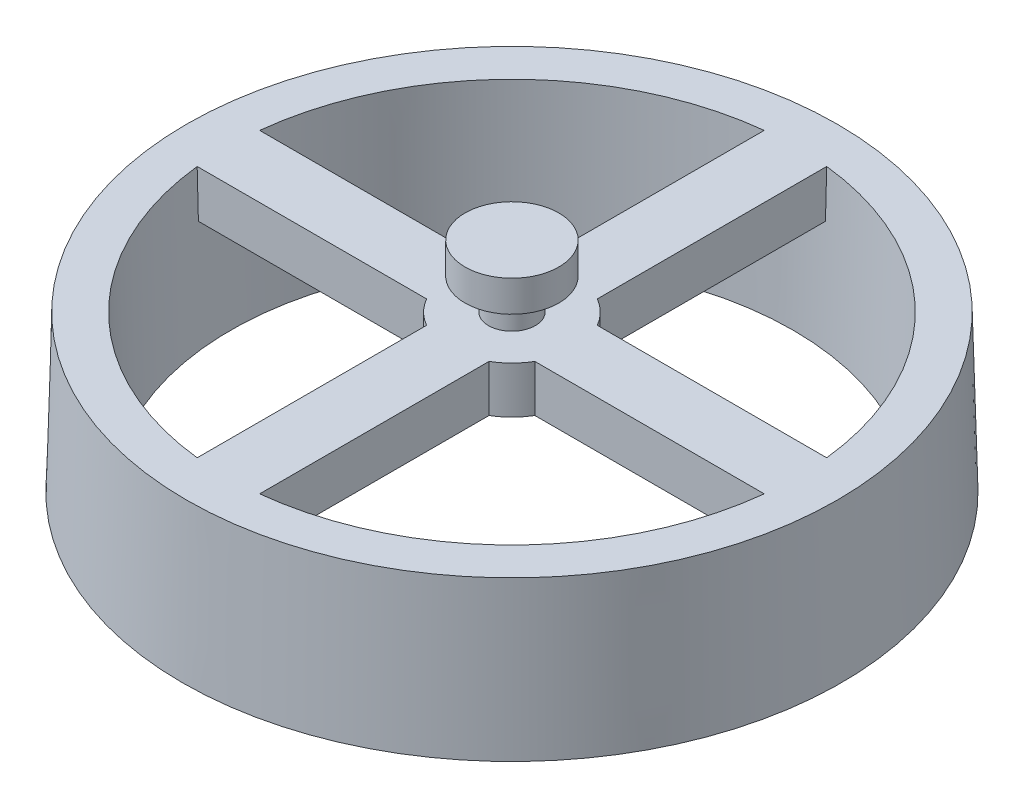
ISO-10303-21;
HEADER;
FILE_DESCRIPTION(('STEP AP214'),'2;1');
FILE_NAME('part.step','',(''),(''),'','','');
FILE_SCHEMA(('AUTOMOTIVE_DESIGN { 1 0 10303 214 1 1 1 1 }'));
ENDSEC;
DATA;
#1=APPLICATION_CONTEXT('core data for automotive mechanical design processes');
#2=APPLICATION_PROTOCOL_DEFINITION('international standard','automotive_design',2000,#1);
#3=PRODUCT_CONTEXT('',#1,'mechanical');
#4=PRODUCT('Part','Part','',(#3));
#5=PRODUCT_RELATED_PRODUCT_CATEGORY('part','',(#4));
#6=PRODUCT_DEFINITION_FORMATION('','',#4);
#7=PRODUCT_DEFINITION_CONTEXT('part definition',#1,'design');
#8=PRODUCT_DEFINITION('design','',#6,#7);
#9=PRODUCT_DEFINITION_SHAPE('','',#8);
#10=(LENGTH_UNIT() NAMED_UNIT(*) SI_UNIT(.MILLI.,.METRE.));
#11=(NAMED_UNIT(*) PLANE_ANGLE_UNIT() SI_UNIT($,.RADIAN.));
#12=(NAMED_UNIT(*) SI_UNIT($,.STERADIAN.) SOLID_ANGLE_UNIT());
#13=UNCERTAINTY_MEASURE_WITH_UNIT(LENGTH_MEASURE(1.E-05),#10,'distance_accuracy_value','');
#14=(GEOMETRIC_REPRESENTATION_CONTEXT(3) GLOBAL_UNCERTAINTY_ASSIGNED_CONTEXT((#13)) GLOBAL_UNIT_ASSIGNED_CONTEXT((#10,
#11,#12)) REPRESENTATION_CONTEXT('',''));
#15=CARTESIAN_POINT('',(0.,0.,0.));
#16=DIRECTION('',(0.,0.,1.));
#17=DIRECTION('',(1.,0.,0.));
#18=AXIS2_PLACEMENT_3D('',#15,#16,#17);
#19=CARTESIAN_POINT('',(0.,5.,0.));
#20=DIRECTION('',(0.,1.,0.));
#21=DIRECTION('',(0.,0.,1.));
#22=AXIS2_PLACEMENT_3D('',#19,#20,#21);
#23=PLANE('',#22);
#24=CARTESIAN_POINT('',(0.,5.,0.));
#25=DIRECTION('',(0.,1.,0.));
#26=DIRECTION('',(0.,0.,1.));
#27=AXIS2_PLACEMENT_3D('',#24,#25,#26);
#28=CIRCLE('',#27,10.4190703921541);
#29=CARTESIAN_POINT('',(0.,5.,10.4190703921541));
#30=VERTEX_POINT('',#29);
#31=EDGE_CURVE('E276',#30,#30,#28,.T.);
#32=ORIENTED_EDGE('',*,*,#31,.T.);
#33=EDGE_LOOP('',(#32));
#34=FACE_BOUND('',#33,.T.);
#35=CARTESIAN_POINT('',(0.,5.,0.));
#36=DIRECTION('',(0.,1.,0.));
#37=DIRECTION('',(0.,0.,1.));
#38=AXIS2_PLACEMENT_3D('',#35,#36,#37);
#39=CIRCLE('',#38,9.13092960784593);
#40=CARTESIAN_POINT('',(0.999999999999936,5.,9.07600548167737));
#41=VERTEX_POINT('',#40);
#42=CARTESIAN_POINT('',(9.07600548167736,5.,1.00000000000003));
#43=VERTEX_POINT('',#42);
#44=EDGE_CURVE('E320',#41,#43,#39,.T.);
#45=ORIENTED_EDGE('',*,*,#44,.F.);
#46=DIRECTION('',(0.,0.,-1.));
#47=VECTOR('',#46,1.);
#48=CARTESIAN_POINT('',(0.999999999999934,5.,9.50000000000001));
#49=LINE('',#48,#47);
#50=CARTESIAN_POINT('',(0.999999999999987,5.,1.73205080756888));
#51=VERTEX_POINT('',#50);
#52=EDGE_CURVE('E177',#41,#51,#49,.T.);
#53=ORIENTED_EDGE('',*,*,#52,.T.);
#54=CARTESIAN_POINT('',(0.,5.,0.));
#55=DIRECTION('',(0.,1.,0.));
#56=DIRECTION('',(0.,0.,1.));
#57=AXIS2_PLACEMENT_3D('',#54,#55,#56);
#58=CIRCLE('',#57,2.);
#59=CARTESIAN_POINT('',(1.73205080756887,5.,1.00000000000001));
#60=VERTEX_POINT('',#59);
#61=EDGE_CURVE('E548',#51,#60,#58,.T.);
#62=ORIENTED_EDGE('',*,*,#61,.T.);
#63=DIRECTION('',(1.,0.,0.));
#64=VECTOR('',#63,1.);
#65=CARTESIAN_POINT('',(9.5,5.,1.00000000000003));
#66=LINE('',#65,#64);
#67=EDGE_CURVE('E189',#60,#43,#66,.T.);
#68=ORIENTED_EDGE('',*,*,#67,.T.);
#69=EDGE_LOOP('',(#45,#53,#62,#68));
#70=FACE_BOUND('',#69,.T.);
#71=CARTESIAN_POINT('',(-9.07600548167737,5.,0.999999999999905));
#72=VERTEX_POINT('',#71);
#73=CARTESIAN_POINT('',(-1.00000000000006,5.,9.07600548167735));
#74=VERTEX_POINT('',#73);
#75=EDGE_CURVE('E282',#72,#74,#39,.T.);
#76=ORIENTED_EDGE('',*,*,#75,.F.);
#77=DIRECTION('',(1.,0.,0.));
#78=VECTOR('',#77,1.);
#79=CARTESIAN_POINT('',(-9.50000000000001,5.,0.999999999999901));
#80=LINE('',#79,#78);
#81=CARTESIAN_POINT('',(-1.73205080756889,5.,0.999999999999981));
#82=VERTEX_POINT('',#81);
#83=EDGE_CURVE('E348',#72,#82,#80,.T.);
#84=ORIENTED_EDGE('',*,*,#83,.T.);
#85=CARTESIAN_POINT('',(-1.00000000000001,5.,1.73205080756887));
#86=VERTEX_POINT('',#85);
#87=EDGE_CURVE('E258',#82,#86,#58,.T.);
#88=ORIENTED_EDGE('',*,*,#87,.T.);
#89=DIRECTION('',(0.,0.,1.));
#90=VECTOR('',#89,1.);
#91=CARTESIAN_POINT('',(-1.00000000000007,5.,9.49999999999999));
#92=LINE('',#91,#90);
#93=EDGE_CURVE('E168',#86,#74,#92,.T.);
#94=ORIENTED_EDGE('',*,*,#93,.T.);
#95=EDGE_LOOP('',(#76,#84,#88,#94));
#96=FACE_BOUND('',#95,.T.);
#97=CARTESIAN_POINT('',(9.07600548167736,5.,-0.999999999999968));
#98=VERTEX_POINT('',#97);
#99=CARTESIAN_POINT('',(1.,5.,-9.07600548167736));
#100=VERTEX_POINT('',#99);
#101=EDGE_CURVE('E272',#98,#100,#39,.T.);
#102=ORIENTED_EDGE('',*,*,#101,.F.);
#103=DIRECTION('',(-1.,0.,0.));
#104=VECTOR('',#103,1.);
#105=CARTESIAN_POINT('',(9.5,5.,-0.999999999999967));
#106=LINE('',#105,#104);
#107=CARTESIAN_POINT('',(1.73205080756888,5.,-0.999999999999993));
#108=VERTEX_POINT('',#107);
#109=EDGE_CURVE('E195',#98,#108,#106,.T.);
#110=ORIENTED_EDGE('',*,*,#109,.T.);
#111=CARTESIAN_POINT('',(1.,5.,-1.73205080756888));
#112=VERTEX_POINT('',#111);
#113=EDGE_CURVE('E259',#108,#112,#58,.T.);
#114=ORIENTED_EDGE('',*,*,#113,.T.);
#115=DIRECTION('',(0.,0.,-1.));
#116=VECTOR('',#115,1.);
#117=CARTESIAN_POINT('',(1.,5.,-9.5));
#118=LINE('',#117,#116);
#119=EDGE_CURVE('E257',#112,#100,#118,.T.);
#120=ORIENTED_EDGE('',*,*,#119,.T.);
#121=EDGE_LOOP('',(#102,#110,#114,#120));
#122=FACE_BOUND('',#121,.T.);
#123=DIRECTION('',(0.,0.,1.));
#124=VECTOR('',#123,1.);
#125=CARTESIAN_POINT('',(-1.,5.,-9.5));
#126=LINE('',#125,#124);
#127=CARTESIAN_POINT('',(-1.,5.,-9.07600548167736));
#128=VERTEX_POINT('',#127);
#129=CARTESIAN_POINT('',(-0.999999999999999,5.,-1.73205080756888));
#130=VERTEX_POINT('',#129);
#131=EDGE_CURVE('E262',#128,#130,#126,.T.);
#132=ORIENTED_EDGE('',*,*,#131,.T.);
#133=CARTESIAN_POINT('',(-1.73205080756887,5.,-1.00000000000002));
#134=VERTEX_POINT('',#133);
#135=EDGE_CURVE('E254',#130,#134,#58,.T.);
#136=ORIENTED_EDGE('',*,*,#135,.T.);
#137=DIRECTION('',(-1.,0.,0.));
#138=VECTOR('',#137,1.);
#139=CARTESIAN_POINT('',(-9.49999999999999,5.,-1.0000000000001));
#140=LINE('',#139,#138);
#141=CARTESIAN_POINT('',(-9.07600548167735,5.,-1.0000000000001));
#142=VERTEX_POINT('',#141);
#143=EDGE_CURVE('E337',#134,#142,#140,.T.);
#144=ORIENTED_EDGE('',*,*,#143,.T.);
#145=EDGE_CURVE('E277',#128,#142,#39,.T.);
#146=ORIENTED_EDGE('',*,*,#145,.F.);
#147=EDGE_LOOP('',(#132,#136,#144,#146));
#148=FACE_BOUND('',#147,.T.);
#149=CARTESIAN_POINT('',(0.,5.,0.));
#150=DIRECTION('',(0.,1.,0.));
#151=DIRECTION('',(0.,0.,1.));
#152=AXIS2_PLACEMENT_3D('',#149,#150,#151);
#153=CIRCLE('',#152,0.75);
#154=CARTESIAN_POINT('',(0.,5.,0.75));
#155=VERTEX_POINT('',#154);
#156=EDGE_CURVE('E331',#155,#155,#153,.T.);
#157=ORIENTED_EDGE('',*,*,#156,.F.);
#158=EDGE_LOOP('',(#157));
#159=FACE_BOUND('',#158,.T.);
#160=ADVANCED_FACE('F31',(#34,#70,#96,#122,#148,#159),#23,.T.);
#161=CARTESIAN_POINT('',(0.,3.5,0.));
#162=DIRECTION('',(0.,1.,0.));
#163=DIRECTION('',(0.,0.,1.));
#164=AXIS2_PLACEMENT_3D('',#161,#162,#163);
#165=CYLINDRICAL_SURFACE('',#164,2.);
#166=DIRECTION('',(0.,1.,0.));
#167=VECTOR('',#166,1.);
#168=CARTESIAN_POINT('',(1.73205080756888,3.5,-0.999999999999993));
#169=LINE('',#168,#167);
#170=CARTESIAN_POINT('',(1.73205080756888,3.5,-0.999999999999993));
#171=VERTEX_POINT('',#170);
#172=EDGE_CURVE('E202',#171,#108,#169,.T.);
#173=ORIENTED_EDGE('',*,*,#172,.F.);
#174=CARTESIAN_POINT('',(0.,3.5,0.));
#175=DIRECTION('',(0.,1.,0.));
#176=DIRECTION('',(0.,0.,1.));
#177=AXIS2_PLACEMENT_3D('',#174,#175,#176);
#178=CIRCLE('',#177,2.);
#179=CARTESIAN_POINT('',(1.,3.5,-1.73205080756888));
#180=VERTEX_POINT('',#179);
#181=EDGE_CURVE('E248',#171,#180,#178,.T.);
#182=ORIENTED_EDGE('',*,*,#181,.T.);
#183=DIRECTION('',(0.,1.,0.));
#184=VECTOR('',#183,1.);
#185=CARTESIAN_POINT('',(1.,3.5,-1.73205080756888));
#186=LINE('',#185,#184);
#187=EDGE_CURVE('E253',#180,#112,#186,.T.);
#188=ORIENTED_EDGE('',*,*,#187,.T.);
#189=ORIENTED_EDGE('',*,*,#113,.F.);
#190=EDGE_LOOP('',(#173,#182,#188,#189));
#191=FACE_BOUND('',#190,.T.);
#192=ADVANCED_FACE('F297',(#191),#165,.T.);
#193=DIRECTION('',(0.,1.,0.));
#194=VECTOR('',#193,1.);
#195=CARTESIAN_POINT('',(-1.73205080756887,3.5,-1.00000000000002));
#196=LINE('',#195,#194);
#197=CARTESIAN_POINT('',(-1.73205080756887,3.5,-1.00000000000002));
#198=VERTEX_POINT('',#197);
#199=EDGE_CURVE('E184',#198,#134,#196,.T.);
#200=ORIENTED_EDGE('',*,*,#199,.T.);
#201=ORIENTED_EDGE('',*,*,#135,.F.);
#202=DIRECTION('',(0.,1.,0.));
#203=VECTOR('',#202,1.);
#204=CARTESIAN_POINT('',(-0.999999999999999,3.5,-1.73205080756888));
#205=LINE('',#204,#203);
#206=CARTESIAN_POINT('',(-0.999999999999999,3.5,-1.73205080756888));
#207=VERTEX_POINT('',#206);
#208=EDGE_CURVE('E264',#207,#130,#205,.T.);
#209=ORIENTED_EDGE('',*,*,#208,.F.);
#210=EDGE_CURVE('E158',#207,#198,#178,.T.);
#211=ORIENTED_EDGE('',*,*,#210,.T.);
#212=EDGE_LOOP('',(#200,#201,#209,#211));
#213=FACE_BOUND('',#212,.T.);
#214=ADVANCED_FACE('F356',(#213),#165,.T.);
#215=DIRECTION('',(0.,1.,0.));
#216=VECTOR('',#215,1.);
#217=CARTESIAN_POINT('',(1.73205080756887,3.5,1.00000000000001));
#218=LINE('',#217,#216);
#219=CARTESIAN_POINT('',(1.73205080756887,3.5,1.00000000000001));
#220=VERTEX_POINT('',#219);
#221=EDGE_CURVE('E197',#220,#60,#218,.T.);
#222=ORIENTED_EDGE('',*,*,#221,.T.);
#223=ORIENTED_EDGE('',*,*,#61,.F.);
#224=DIRECTION('',(0.,1.,0.));
#225=VECTOR('',#224,1.);
#226=CARTESIAN_POINT('',(0.999999999999987,3.5,1.73205080756888));
#227=LINE('',#226,#225);
#228=CARTESIAN_POINT('',(0.999999999999987,3.5,1.73205080756888));
#229=VERTEX_POINT('',#228);
#230=EDGE_CURVE('E169',#229,#51,#227,.T.);
#231=ORIENTED_EDGE('',*,*,#230,.F.);
#232=EDGE_CURVE('E159',#229,#220,#178,.T.);
#233=ORIENTED_EDGE('',*,*,#232,.T.);
#234=EDGE_LOOP('',(#222,#223,#231,#233));
#235=FACE_BOUND('',#234,.T.);
#236=ADVANCED_FACE('F298',(#235),#165,.T.);
#237=CARTESIAN_POINT('',(0.,0.,0.));
#238=DIRECTION('',(0.,1.,0.));
#239=DIRECTION('',(0.,0.,1.));
#240=AXIS2_PLACEMENT_3D('',#237,#238,#239);
#241=PLANE('',#240);
#242=CARTESIAN_POINT('',(0.,0.,0.));
#243=DIRECTION('',(0.,1.,0.));
#244=DIRECTION('',(0.,0.,1.));
#245=AXIS2_PLACEMENT_3D('',#242,#243,#244);
#246=CIRCLE('',#245,10.55);
#247=CARTESIAN_POINT('',(0.,0.,10.55));
#248=VERTEX_POINT('',#247);
#249=EDGE_CURVE('E273',#248,#248,#246,.T.);
#250=ORIENTED_EDGE('',*,*,#249,.F.);
#251=EDGE_LOOP('',(#250));
#252=FACE_BOUND('',#251,.T.);
#253=CARTESIAN_POINT('',(0.,0.,0.));
#254=DIRECTION('',(0.,1.,0.));
#255=DIRECTION('',(0.,0.,1.));
#256=AXIS2_PLACEMENT_3D('',#253,#254,#255);
#257=CIRCLE('',#256,9.);
#258=CARTESIAN_POINT('',(0.,0.,9.));
#259=VERTEX_POINT('',#258);
#260=EDGE_CURVE('E267',#259,#259,#257,.T.);
#261=ORIENTED_EDGE('',*,*,#260,.T.);
#262=EDGE_LOOP('',(#261));
#263=FACE_BOUND('',#262,.T.);
#264=ADVANCED_FACE('F302',(#252,#263),#241,.F.);
#265=CARTESIAN_POINT('',(0.,0.,0.));
#266=DIRECTION('',(0.,-1.,0.));
#267=DIRECTION('',(0.,0.,1.));
#268=AXIS2_PLACEMENT_3D('',#265,#266,#267);
#269=CONICAL_SURFACE('',#268,10.55,0.026179938779915);
#270=ORIENTED_EDGE('',*,*,#31,.F.);
#271=EDGE_LOOP('',(#270));
#272=FACE_BOUND('',#271,.T.);
#273=ORIENTED_EDGE('',*,*,#249,.T.);
#274=EDGE_LOOP('',(#273));
#275=FACE_BOUND('',#274,.T.);
#276=ADVANCED_FACE('F304',(#272,#275),#269,.T.);
#277=CARTESIAN_POINT('',(0.,0.,0.));
#278=DIRECTION('',(0.,1.,0.));
#279=DIRECTION('',(0.,0.,1.));
#280=AXIS2_PLACEMENT_3D('',#277,#278,#279);
#281=CONICAL_SURFACE('',#280,9.,0.026179938779915);
#282=CARTESIAN_POINT('',(9.42579223211915,18.2804236839161,-0.999999999999967));
#283=CARTESIAN_POINT('',(9.30244407730847,13.5961445368287,-0.999999999999967));
#284=CARTESIAN_POINT('',(9.17906550105769,8.91186619120519,-0.999999999999968));
#285=CARTESIAN_POINT('',(8.93224750567553,-0.456688897130122,-0.999999999999969));
#286=CARTESIAN_POINT('',(8.80880808654414,-5.14096563984194,-0.999999999999969));
#287=CARTESIAN_POINT('',(8.68533824597266,-9.82524158108984,-0.99999999999997));
#288=B_SPLINE_CURVE_WITH_KNOTS('',3,(#282,#283,#284,#285,#286,#287),.UNSPECIFIED.,.F.,.F.,(4,2,
4),(0.,14.05770866931,28.1154173386685),.UNSPECIFIED.);
#289=CARTESIAN_POINT('',(9.03648786389613,3.5,-0.999999999999968));
#290=VERTEX_POINT('',#289);
#291=EDGE_CURVE('E235',#98,#290,#288,.T.);
#292=ORIENTED_EDGE('',*,*,#291,.F.);
#293=ORIENTED_EDGE('',*,*,#101,.T.);
#294=CARTESIAN_POINT('',(1.,-9.82524158108985,-8.68533824597266));
#295=CARTESIAN_POINT('',(1.,-5.14096563984194,-8.80880808654414));
#296=CARTESIAN_POINT('',(1.,-0.456688897130124,-8.93224750567552));
#297=CARTESIAN_POINT('',(1.,8.9118661912052,-9.17906550105769));
#298=CARTESIAN_POINT('',(1.,13.5961445368287,-9.30244407730846));
#299=CARTESIAN_POINT('',(1.,18.2804236839161,-9.42579223211915));
#300=B_SPLINE_CURVE_WITH_KNOTS('',3,(#294,#295,#296,#297,#298,#299),.UNSPECIFIED.,.F.,.F.,(4,2,
4),(0.,14.0577086693585,28.1154173386685),.UNSPECIFIED.);
#301=CARTESIAN_POINT('',(1.,3.5,-9.03648786389613));
#302=VERTEX_POINT('',#301);
#303=EDGE_CURVE('E44',#302,#100,#300,.T.);
#304=ORIENTED_EDGE('',*,*,#303,.F.);
#305=CARTESIAN_POINT('',(0.,3.5,0.));
#306=DIRECTION('',(0.,1.,0.));
#307=DIRECTION('',(0.,0.,1.));
#308=AXIS2_PLACEMENT_3D('',#305,#306,#307);
#309=CIRCLE('',#308,9.09165072549215);
#310=CARTESIAN_POINT('',(-1.,3.5,-9.03648786389612));
#311=VERTEX_POINT('',#310);
#312=EDGE_CURVE('E280',#302,#311,#309,.T.);
#313=ORIENTED_EDGE('',*,*,#312,.T.);
#314=CARTESIAN_POINT('',(-1.,18.2804236839161,-9.42579223211915));
#315=CARTESIAN_POINT('',(-1.,13.5961445368287,-9.30244407730846));
#316=CARTESIAN_POINT('',(-1.,8.9118661912052,-9.17906550105769));
#317=CARTESIAN_POINT('',(-1.,-0.456688897130123,-8.93224750567552));
#318=CARTESIAN_POINT('',(-1.,-5.14096563984194,-8.80880808654414));
#319=CARTESIAN_POINT('',(-1.,-9.82524158108984,-8.68533824597266));
#320=B_SPLINE_CURVE_WITH_KNOTS('',3,(#314,#315,#316,#317,#318,#319),.UNSPECIFIED.,.F.,.F.,(4,2,
4),(0.,14.05770866931,28.1154173386685),.UNSPECIFIED.);
#321=EDGE_CURVE('E11',#128,#311,#320,.T.);
#322=ORIENTED_EDGE('',*,*,#321,.F.);
#323=ORIENTED_EDGE('',*,*,#145,.T.);
#324=CARTESIAN_POINT('',(-8.68533824597265,-9.82524158108987,-1.00000000000009));
#325=CARTESIAN_POINT('',(-8.80880808654413,-5.14096563984196,-1.00000000000009));
#326=CARTESIAN_POINT('',(-8.93224750567551,-0.456688897130131,-1.00000000000009));
#327=CARTESIAN_POINT('',(-9.17906550105768,8.9118661912052,-1.0000000000001));
#328=CARTESIAN_POINT('',(-9.30244407730845,13.5961445368287,-1.0000000000001));
#329=CARTESIAN_POINT('',(-9.42579223211914,18.2804236839161,-1.0000000000001));
#330=B_SPLINE_CURVE_WITH_KNOTS('',3,(#324,#325,#326,#327,#328,#329),.UNSPECIFIED.,.F.,.F.,(4,2,
4),(0.,14.0577086693585,28.1154173386686),.UNSPECIFIED.);
#331=CARTESIAN_POINT('',(-9.03648786389611,3.5,-1.00000000000009));
#332=VERTEX_POINT('',#331);
#333=EDGE_CURVE('E363',#332,#142,#330,.T.);
#334=ORIENTED_EDGE('',*,*,#333,.F.);
#335=CARTESIAN_POINT('',(0.,3.5,0.));
#336=DIRECTION('',(0.,1.,0.));
#337=DIRECTION('',(0.,0.,1.));
#338=AXIS2_PLACEMENT_3D('',#335,#336,#337);
#339=CIRCLE('',#338,9.09165072549215);
#340=CARTESIAN_POINT('',(-9.03648786389614,3.5,0.999999999999905));
#341=VERTEX_POINT('',#340);
#342=EDGE_CURVE('E245',#332,#341,#339,.T.);
#343=ORIENTED_EDGE('',*,*,#342,.T.);
#344=CARTESIAN_POINT('',(-9.42579223211916,18.2804236839161,0.999999999999901));
#345=CARTESIAN_POINT('',(-9.30244407730848,13.5961445368287,0.999999999999903));
#346=CARTESIAN_POINT('',(-9.1790655010577,8.91186619120519,0.999999999999904));
#347=CARTESIAN_POINT('',(-8.93224750567554,-0.456688897130119,0.999999999999906));
#348=CARTESIAN_POINT('',(-8.80880808654415,-5.14096563984193,0.999999999999908));
#349=CARTESIAN_POINT('',(-8.68533824597267,-9.82524158108983,0.999999999999909));
#350=B_SPLINE_CURVE_WITH_KNOTS('',3,(#344,#345,#346,#347,#348,#349),.UNSPECIFIED.,.F.,.F.,(4,2,
4),(0.,14.05770866931,28.1154173386685),.UNSPECIFIED.);
#351=EDGE_CURVE('E365',#72,#341,#350,.T.);
#352=ORIENTED_EDGE('',*,*,#351,.F.);
#353=ORIENTED_EDGE('',*,*,#75,.T.);
#354=CARTESIAN_POINT('',(-1.00000000000006,-9.82524158108986,8.68533824597265));
#355=CARTESIAN_POINT('',(-1.00000000000006,-5.14096563984195,8.80880808654413));
#356=CARTESIAN_POINT('',(-1.00000000000006,-0.456688897130129,8.93224750567552));
#357=CARTESIAN_POINT('',(-1.00000000000006,8.9118661912052,9.17906550105768));
#358=CARTESIAN_POINT('',(-1.00000000000007,13.5961445368287,9.30244407730846));
#359=CARTESIAN_POINT('',(-1.00000000000007,18.2804236839161,9.42579223211914));
#360=B_SPLINE_CURVE_WITH_KNOTS('',3,(#354,#355,#356,#357,#358,#359),.UNSPECIFIED.,.F.,.F.,(4,2,
4),(0.,14.0577086693585,28.1154173386685),.UNSPECIFIED.);
#361=CARTESIAN_POINT('',(-1.00000000000006,3.5,9.03648786389612));
#362=VERTEX_POINT('',#361);
#363=EDGE_CURVE('E204',#362,#74,#360,.T.);
#364=ORIENTED_EDGE('',*,*,#363,.F.);
#365=CARTESIAN_POINT('',(0.999999999999936,3.5,9.03648786389613));
#366=VERTEX_POINT('',#365);
#367=EDGE_CURVE('E176',#362,#366,#339,.T.);
#368=ORIENTED_EDGE('',*,*,#367,.T.);
#369=CARTESIAN_POINT('',(0.999999999999934,18.2804236839161,9.42579223211916));
#370=CARTESIAN_POINT('',(0.999999999999935,13.5961445368287,9.30244407730847));
#371=CARTESIAN_POINT('',(0.999999999999936,8.91186619120519,9.1790655010577));
#372=CARTESIAN_POINT('',(0.999999999999938,-0.456688897130121,8.93224750567553));
#373=CARTESIAN_POINT('',(0.999999999999938,-5.14096563984194,8.80880808654415));
#374=CARTESIAN_POINT('',(0.999999999999939,-9.82524158108983,8.68533824597266));
#375=B_SPLINE_CURVE_WITH_KNOTS('',3,(#369,#370,#371,#372,#373,#374),.UNSPECIFIED.,.F.,.F.,(4,2,
4),(0.,14.05770866931,28.1154173386685),.UNSPECIFIED.);
#376=EDGE_CURVE('E212',#41,#366,#375,.T.);
#377=ORIENTED_EDGE('',*,*,#376,.F.);
#378=ORIENTED_EDGE('',*,*,#44,.T.);
#379=CARTESIAN_POINT('',(8.68533824597265,-9.82524158108985,1.00000000000003));
#380=CARTESIAN_POINT('',(8.80880808654413,-5.14096563984195,1.00000000000003));
#381=CARTESIAN_POINT('',(8.93224750567552,-0.456688897130127,1.00000000000003));
#382=CARTESIAN_POINT('',(9.17906550105768,8.9118661912052,1.00000000000003));
#383=CARTESIAN_POINT('',(9.30244407730846,13.5961445368287,1.00000000000003));
#384=CARTESIAN_POINT('',(9.42579223211915,18.2804236839161,1.00000000000003));
#385=B_SPLINE_CURVE_WITH_KNOTS('',3,(#379,#380,#381,#382,#383,#384),.UNSPECIFIED.,.F.,.F.,(4,2,
4),(0.,14.0577086693585,28.1154173386685),.UNSPECIFIED.);
#386=CARTESIAN_POINT('',(9.03648786389612,3.5,1.00000000000003));
#387=VERTEX_POINT('',#386);
#388=EDGE_CURVE('E56',#387,#43,#385,.T.);
#389=ORIENTED_EDGE('',*,*,#388,.F.);
#390=EDGE_CURVE('E51',#387,#290,#339,.T.);
#391=ORIENTED_EDGE('',*,*,#390,.T.);
#392=EDGE_LOOP('',(#292,#293,#304,#313,#322,#323,#334,#343,#352,#353,#364,#368,#377,#378,#389,#391));
#393=FACE_BOUND('',#392,.T.);
#394=ORIENTED_EDGE('',*,*,#260,.F.);
#395=EDGE_LOOP('',(#394));
#396=FACE_BOUND('',#395,.T.);
#397=ADVANCED_FACE('F33',(#393,#396),#281,.F.);
#398=DIRECTION('',(0.,1.,0.));
#399=VECTOR('',#398,1.);
#400=CARTESIAN_POINT('',(-1.73205080756889,3.5,0.999999999999981));
#401=LINE('',#400,#399);
#402=CARTESIAN_POINT('',(-1.73205080756889,3.5,0.999999999999981));
#403=VERTEX_POINT('',#402);
#404=EDGE_CURVE('E153',#403,#82,#401,.T.);
#405=ORIENTED_EDGE('',*,*,#404,.F.);
#406=CARTESIAN_POINT('',(-1.00000000000001,3.5,1.73205080756887));
#407=VERTEX_POINT('',#406);
#408=EDGE_CURVE('E147',#403,#407,#178,.T.);
#409=ORIENTED_EDGE('',*,*,#408,.T.);
#410=DIRECTION('',(0.,1.,0.));
#411=VECTOR('',#410,1.);
#412=CARTESIAN_POINT('',(-1.00000000000001,3.5,1.73205080756887));
#413=LINE('',#412,#411);
#414=EDGE_CURVE('E150',#407,#86,#413,.T.);
#415=ORIENTED_EDGE('',*,*,#414,.T.);
#416=ORIENTED_EDGE('',*,*,#87,.F.);
#417=EDGE_LOOP('',(#405,#409,#415,#416));
#418=FACE_BOUND('',#417,.T.);
#419=ADVANCED_FACE('F149',(#418),#165,.T.);
#420=CARTESIAN_POINT('',(-1.,3.5,-9.5));
#421=DIRECTION('',(-1.,0.,0.));
#422=DIRECTION('',(0.,0.,1.));
#423=AXIS2_PLACEMENT_3D('',#420,#421,#422);
#424=PLANE('',#423);
#425=ORIENTED_EDGE('',*,*,#131,.F.);
#426=ORIENTED_EDGE('',*,*,#321,.T.);
#427=DIRECTION('',(0.,0.,1.));
#428=VECTOR('',#427,1.);
#429=CARTESIAN_POINT('',(-1.,3.5,-9.5));
#430=LINE('',#429,#428);
#431=EDGE_CURVE('E251',#311,#207,#430,.T.);
#432=ORIENTED_EDGE('',*,*,#431,.T.);
#433=ORIENTED_EDGE('',*,*,#208,.T.);
#434=EDGE_LOOP('',(#425,#426,#432,#433));
#435=FACE_BOUND('',#434,.T.);
#436=ADVANCED_FACE('F292',(#435),#424,.T.);
#437=CARTESIAN_POINT('',(1.,3.5,-9.5));
#438=DIRECTION('',(1.,0.,0.));
#439=DIRECTION('',(0.,0.,-1.));
#440=AXIS2_PLACEMENT_3D('',#437,#438,#439);
#441=PLANE('',#440);
#442=DIRECTION('',(0.,0.,-1.));
#443=VECTOR('',#442,1.);
#444=CARTESIAN_POINT('',(1.,3.5,-9.5));
#445=LINE('',#444,#443);
#446=EDGE_CURVE('E247',#180,#302,#445,.T.);
#447=ORIENTED_EDGE('',*,*,#446,.T.);
#448=ORIENTED_EDGE('',*,*,#303,.T.);
#449=ORIENTED_EDGE('',*,*,#119,.F.);
#450=ORIENTED_EDGE('',*,*,#187,.F.);
#451=EDGE_LOOP('',(#447,#448,#449,#450));
#452=FACE_BOUND('',#451,.T.);
#453=ADVANCED_FACE('F288',(#452),#441,.T.);
#454=CARTESIAN_POINT('',(0.,3.5,0.));
#455=DIRECTION('',(0.,1.,0.));
#456=DIRECTION('',(0.,0.,1.));
#457=AXIS2_PLACEMENT_3D('',#454,#455,#456);
#458=PLANE('',#457);
#459=ORIENTED_EDGE('',*,*,#446,.F.);
#460=ORIENTED_EDGE('',*,*,#181,.F.);
#461=DIRECTION('',(-1.,0.,0.));
#462=VECTOR('',#461,1.);
#463=CARTESIAN_POINT('',(9.5,3.5,-0.999999999999967));
#464=LINE('',#463,#462);
#465=EDGE_CURVE('E194',#290,#171,#464,.T.);
#466=ORIENTED_EDGE('',*,*,#465,.F.);
#467=ORIENTED_EDGE('',*,*,#390,.F.);
#468=DIRECTION('',(1.,0.,0.));
#469=VECTOR('',#468,1.);
#470=CARTESIAN_POINT('',(9.5,3.5,1.00000000000003));
#471=LINE('',#470,#469);
#472=EDGE_CURVE('E191',#220,#387,#471,.T.);
#473=ORIENTED_EDGE('',*,*,#472,.F.);
#474=ORIENTED_EDGE('',*,*,#232,.F.);
#475=DIRECTION('',(0.,0.,-1.));
#476=VECTOR('',#475,1.);
#477=CARTESIAN_POINT('',(0.999999999999934,3.5,9.50000000000001));
#478=LINE('',#477,#476);
#479=EDGE_CURVE('E170',#366,#229,#478,.T.);
#480=ORIENTED_EDGE('',*,*,#479,.F.);
#481=ORIENTED_EDGE('',*,*,#367,.F.);
#482=DIRECTION('',(0.,0.,1.));
#483=VECTOR('',#482,1.);
#484=CARTESIAN_POINT('',(-1.00000000000007,3.5,9.49999999999999));
#485=LINE('',#484,#483);
#486=EDGE_CURVE('E166',#407,#362,#485,.T.);
#487=ORIENTED_EDGE('',*,*,#486,.F.);
#488=ORIENTED_EDGE('',*,*,#408,.F.);
#489=DIRECTION('',(1.,0.,0.));
#490=VECTOR('',#489,1.);
#491=CARTESIAN_POINT('',(-9.50000000000001,3.5,0.999999999999901));
#492=LINE('',#491,#490);
#493=EDGE_CURVE('E347',#341,#403,#492,.T.);
#494=ORIENTED_EDGE('',*,*,#493,.F.);
#495=ORIENTED_EDGE('',*,*,#342,.F.);
#496=DIRECTION('',(-1.,0.,0.));
#497=VECTOR('',#496,1.);
#498=CARTESIAN_POINT('',(-9.49999999999999,3.5,-1.0000000000001));
#499=LINE('',#498,#497);
#500=EDGE_CURVE('E344',#198,#332,#499,.T.);
#501=ORIENTED_EDGE('',*,*,#500,.F.);
#502=ORIENTED_EDGE('',*,*,#210,.F.);
#503=ORIENTED_EDGE('',*,*,#431,.F.);
#504=ORIENTED_EDGE('',*,*,#312,.F.);
#505=EDGE_LOOP('',(#459,#460,#466,#467,#473,#474,#480,#481,#487,#488,#494,#495,#501,#502,#503,#504));
#506=FACE_BOUND('',#505,.T.);
#507=ADVANCED_FACE('F174',(#506),#458,.F.);
#508=CARTESIAN_POINT('',(0.999999999999934,3.5,9.50000000000001));
#509=DIRECTION('',(1.,0.,0.));
#510=DIRECTION('',(0.,0.,-1.));
#511=AXIS2_PLACEMENT_3D('',#508,#509,#510);
#512=PLANE('',#511);
#513=ORIENTED_EDGE('',*,*,#52,.F.);
#514=ORIENTED_EDGE('',*,*,#376,.T.);
#515=ORIENTED_EDGE('',*,*,#479,.T.);
#516=ORIENTED_EDGE('',*,*,#230,.T.);
#517=EDGE_LOOP('',(#513,#514,#515,#516));
#518=FACE_BOUND('',#517,.T.);
#519=ADVANCED_FACE('F222',(#518),#512,.T.);
#520=CARTESIAN_POINT('',(-1.00000000000007,3.5,9.49999999999999));
#521=DIRECTION('',(-1.,0.,0.));
#522=DIRECTION('',(0.,0.,1.));
#523=AXIS2_PLACEMENT_3D('',#520,#521,#522);
#524=PLANE('',#523);
#525=ORIENTED_EDGE('',*,*,#486,.T.);
#526=ORIENTED_EDGE('',*,*,#363,.T.);
#527=ORIENTED_EDGE('',*,*,#93,.F.);
#528=ORIENTED_EDGE('',*,*,#414,.F.);
#529=EDGE_LOOP('',(#525,#526,#527,#528));
#530=FACE_BOUND('',#529,.T.);
#531=ADVANCED_FACE('F164',(#530),#524,.T.);
#532=CARTESIAN_POINT('',(-9.50000000000001,3.5,0.999999999999901));
#533=DIRECTION('',(0.,0.,1.));
#534=DIRECTION('',(1.,0.,0.));
#535=AXIS2_PLACEMENT_3D('',#532,#533,#534);
#536=PLANE('',#535);
#537=ORIENTED_EDGE('',*,*,#83,.F.);
#538=ORIENTED_EDGE('',*,*,#351,.T.);
#539=ORIENTED_EDGE('',*,*,#493,.T.);
#540=ORIENTED_EDGE('',*,*,#404,.T.);
#541=EDGE_LOOP('',(#537,#538,#539,#540));
#542=FACE_BOUND('',#541,.T.);
#543=ADVANCED_FACE('F221',(#542),#536,.T.);
#544=CARTESIAN_POINT('',(-9.49999999999999,3.5,-1.0000000000001));
#545=DIRECTION('',(0.,0.,-1.));
#546=DIRECTION('',(-1.,0.,0.));
#547=AXIS2_PLACEMENT_3D('',#544,#545,#546);
#548=PLANE('',#547);
#549=ORIENTED_EDGE('',*,*,#500,.T.);
#550=ORIENTED_EDGE('',*,*,#333,.T.);
#551=ORIENTED_EDGE('',*,*,#143,.F.);
#552=ORIENTED_EDGE('',*,*,#199,.F.);
#553=EDGE_LOOP('',(#549,#550,#551,#552));
#554=FACE_BOUND('',#553,.T.);
#555=ADVANCED_FACE('F230',(#554),#548,.T.);
#556=CARTESIAN_POINT('',(9.5,3.5,-0.999999999999967));
#557=DIRECTION('',(0.,0.,-1.));
#558=DIRECTION('',(-1.,0.,0.));
#559=AXIS2_PLACEMENT_3D('',#556,#557,#558);
#560=PLANE('',#559);
#561=ORIENTED_EDGE('',*,*,#109,.F.);
#562=ORIENTED_EDGE('',*,*,#291,.T.);
#563=ORIENTED_EDGE('',*,*,#465,.T.);
#564=ORIENTED_EDGE('',*,*,#172,.T.);
#565=EDGE_LOOP('',(#561,#562,#563,#564));
#566=FACE_BOUND('',#565,.T.);
#567=ADVANCED_FACE('F225',(#566),#560,.T.);
#568=CARTESIAN_POINT('',(9.5,3.5,1.00000000000003));
#569=DIRECTION('',(0.,0.,1.));
#570=DIRECTION('',(1.,0.,0.));
#571=AXIS2_PLACEMENT_3D('',#568,#569,#570);
#572=PLANE('',#571);
#573=ORIENTED_EDGE('',*,*,#472,.T.);
#574=ORIENTED_EDGE('',*,*,#388,.T.);
#575=ORIENTED_EDGE('',*,*,#67,.F.);
#576=ORIENTED_EDGE('',*,*,#221,.F.);
#577=EDGE_LOOP('',(#573,#574,#575,#576));
#578=FACE_BOUND('',#577,.T.);
#579=ADVANCED_FACE('F229',(#578),#572,.T.);
#580=CARTESIAN_POINT('',(0.,6.,0.));
#581=DIRECTION('',(0.,-1.,0.));
#582=DIRECTION('',(0.,0.,-1.));
#583=AXIS2_PLACEMENT_3D('',#580,#581,#582);
#584=CYLINDRICAL_SURFACE('',#583,0.75);
#585=CARTESIAN_POINT('',(0.,6.,0.));
#586=DIRECTION('',(0.,1.,0.));
#587=DIRECTION('',(0.,0.,1.));
#588=AXIS2_PLACEMENT_3D('',#585,#586,#587);
#589=CIRCLE('',#588,0.75);
#590=CARTESIAN_POINT('',(0.,6.,0.75));
#591=VERTEX_POINT('',#590);
#592=EDGE_CURVE('E333',#591,#591,#589,.T.);
#593=ORIENTED_EDGE('',*,*,#592,.F.);
#594=EDGE_LOOP('',(#593));
#595=FACE_BOUND('',#594,.T.);
#596=ORIENTED_EDGE('',*,*,#156,.T.);
#597=EDGE_LOOP('',(#596));
#598=FACE_BOUND('',#597,.T.);
#599=ADVANCED_FACE('F379',(#595,#598),#584,.T.);
#600=CARTESIAN_POINT('',(0.,6.,0.));
#601=DIRECTION('',(0.,1.,0.));
#602=DIRECTION('',(0.,0.,1.));
#603=AXIS2_PLACEMENT_3D('',#600,#601,#602);
#604=PLANE('',#603);
#605=CARTESIAN_POINT('',(0.,6.,0.));
#606=DIRECTION('',(0.,1.,0.));
#607=DIRECTION('',(0.,0.,1.));
#608=AXIS2_PLACEMENT_3D('',#605,#606,#607);
#609=CIRCLE('',#608,1.5);
#610=CARTESIAN_POINT('',(0.,6.,1.5));
#611=VERTEX_POINT('',#610);
#612=EDGE_CURVE('E340',#611,#611,#609,.T.);
#613=ORIENTED_EDGE('',*,*,#612,.F.);
#614=EDGE_LOOP('',(#613));
#615=FACE_BOUND('',#614,.T.);
#616=ORIENTED_EDGE('',*,*,#592,.T.);
#617=EDGE_LOOP('',(#616));
#618=FACE_BOUND('',#617,.T.);
#619=ADVANCED_FACE('F382',(#615,#618),#604,.F.);
#620=CARTESIAN_POINT('',(0.,7.,0.));
#621=DIRECTION('',(0.,-1.,0.));
#622=DIRECTION('',(0.,0.,-1.));
#623=AXIS2_PLACEMENT_3D('',#620,#621,#622);
#624=CYLINDRICAL_SURFACE('',#623,1.5);
#625=CARTESIAN_POINT('',(0.,7.,0.));
#626=DIRECTION('',(0.,1.,0.));
#627=DIRECTION('',(0.,0.,1.));
#628=AXIS2_PLACEMENT_3D('',#625,#626,#627);
#629=CIRCLE('',#628,1.5);
#630=CARTESIAN_POINT('',(0.,7.,1.5));
#631=VERTEX_POINT('',#630);
#632=EDGE_CURVE('E334',#631,#631,#629,.T.);
#633=ORIENTED_EDGE('',*,*,#632,.F.);
#634=EDGE_LOOP('',(#633));
#635=FACE_BOUND('',#634,.T.);
#636=ORIENTED_EDGE('',*,*,#612,.T.);
#637=EDGE_LOOP('',(#636));
#638=FACE_BOUND('',#637,.T.);
#639=ADVANCED_FACE('F384',(#635,#638),#624,.T.);
#640=CARTESIAN_POINT('',(0.,7.,0.));
#641=DIRECTION('',(0.,1.,0.));
#642=DIRECTION('',(0.,0.,1.));
#643=AXIS2_PLACEMENT_3D('',#640,#641,#642);
#644=PLANE('',#643);
#645=ORIENTED_EDGE('',*,*,#632,.T.);
#646=EDGE_LOOP('',(#645));
#647=FACE_BOUND('',#646,.T.);
#648=ADVANCED_FACE('F387',(#647),#644,.T.);
#649=CLOSED_SHELL('',(#160,#192,#214,#236,#264,#276,#397,#419,#436,#453,#507,#519,#531,#543,
#555,#567,#579,#599,#619,#639,#648));
#650=MANIFOLD_SOLID_BREP('B2',#649);
#651=ADVANCED_BREP_SHAPE_REPRESENTATION('',(#18,#650),#14);
#652=SHAPE_DEFINITION_REPRESENTATION(#9,#651);
ENDSEC;
END-ISO-10303-21;
